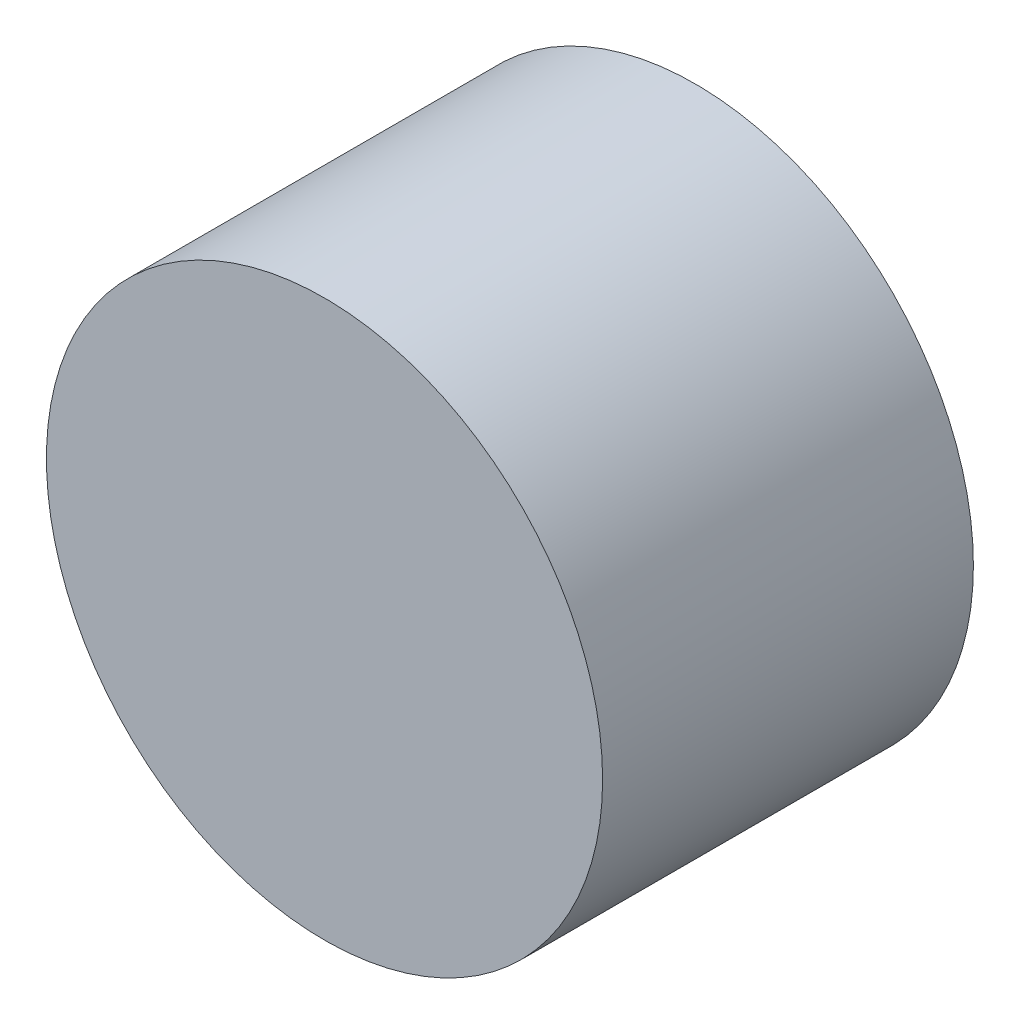
ISO-10303-21;
HEADER;
FILE_DESCRIPTION(('STEP AP214'),'2;1');
FILE_NAME('part.step','',(''),(''),'','','');
FILE_SCHEMA(('AUTOMOTIVE_DESIGN { 1 0 10303 214 1 1 1 1 }'));
ENDSEC;
DATA;
#1=APPLICATION_CONTEXT('core data for automotive mechanical design processes');
#2=APPLICATION_PROTOCOL_DEFINITION('international standard','automotive_design',2000,#1);
#3=PRODUCT_CONTEXT('',#1,'mechanical');
#4=PRODUCT('Part','Part','',(#3));
#5=PRODUCT_RELATED_PRODUCT_CATEGORY('part','',(#4));
#6=PRODUCT_DEFINITION_FORMATION('','',#4);
#7=PRODUCT_DEFINITION_CONTEXT('part definition',#1,'design');
#8=PRODUCT_DEFINITION('design','',#6,#7);
#9=PRODUCT_DEFINITION_SHAPE('','',#8);
#10=(LENGTH_UNIT() NAMED_UNIT(*) SI_UNIT(.MILLI.,.METRE.));
#11=(NAMED_UNIT(*) PLANE_ANGLE_UNIT() SI_UNIT($,.RADIAN.));
#12=(NAMED_UNIT(*) SI_UNIT($,.STERADIAN.) SOLID_ANGLE_UNIT());
#13=UNCERTAINTY_MEASURE_WITH_UNIT(LENGTH_MEASURE(1.E-05),#10,'distance_accuracy_value','');
#14=(GEOMETRIC_REPRESENTATION_CONTEXT(3) GLOBAL_UNCERTAINTY_ASSIGNED_CONTEXT((#13)) GLOBAL_UNIT_ASSIGNED_CONTEXT((#10,
#11,#12)) REPRESENTATION_CONTEXT('',''));
#15=CARTESIAN_POINT('',(0.,0.,0.));
#16=DIRECTION('',(0.,0.,1.));
#17=DIRECTION('',(1.,0.,0.));
#18=AXIS2_PLACEMENT_3D('',#15,#16,#17);
#19=CARTESIAN_POINT('',(0.,0.,2.));
#20=DIRECTION('',(0.,0.,-1.));
#21=DIRECTION('',(-1.,0.,0.));
#22=AXIS2_PLACEMENT_3D('',#19,#20,#21);
#23=CYLINDRICAL_SURFACE('',#22,1.5);
#24=CARTESIAN_POINT('',(0.,0.,2.));
#25=DIRECTION('',(0.,0.,1.));
#26=DIRECTION('',(1.,0.,0.));
#27=AXIS2_PLACEMENT_3D('',#24,#25,#26);
#28=CIRCLE('',#27,1.5);
#29=CARTESIAN_POINT('',(1.5,0.,2.));
#30=VERTEX_POINT('',#29);
#31=EDGE_CURVE('E10',#30,#30,#28,.T.);
#32=ORIENTED_EDGE('',*,*,#31,.F.);
#33=EDGE_LOOP('',(#32));
#34=FACE_BOUND('',#33,.T.);
#35=CARTESIAN_POINT('',(0.,0.,0.));
#36=DIRECTION('',(0.,0.,1.));
#37=DIRECTION('',(1.,0.,0.));
#38=AXIS2_PLACEMENT_3D('',#35,#36,#37);
#39=CIRCLE('',#38,1.5);
#40=CARTESIAN_POINT('',(1.5,0.,0.));
#41=VERTEX_POINT('',#40);
#42=EDGE_CURVE('E34',#41,#41,#39,.T.);
#43=ORIENTED_EDGE('',*,*,#42,.T.);
#44=EDGE_LOOP('',(#43));
#45=FACE_BOUND('',#44,.T.);
#46=ADVANCED_FACE('F31',(#34,#45),#23,.T.);
#47=CARTESIAN_POINT('',(0.,0.,2.));
#48=DIRECTION('',(0.,0.,1.));
#49=DIRECTION('',(1.,0.,0.));
#50=AXIS2_PLACEMENT_3D('',#47,#48,#49);
#51=PLANE('',#50);
#52=ORIENTED_EDGE('',*,*,#31,.T.);
#53=EDGE_LOOP('',(#52));
#54=FACE_BOUND('',#53,.T.);
#55=ADVANCED_FACE('F46',(#54),#51,.T.);
#56=CARTESIAN_POINT('',(0.,0.,0.));
#57=DIRECTION('',(0.,0.,1.));
#58=DIRECTION('',(1.,0.,0.));
#59=AXIS2_PLACEMENT_3D('',#56,#57,#58);
#60=PLANE('',#59);
#61=ORIENTED_EDGE('',*,*,#42,.F.);
#62=EDGE_LOOP('',(#61));
#63=FACE_BOUND('',#62,.T.);
#64=ADVANCED_FACE('F44',(#63),#60,.F.);
#65=CLOSED_SHELL('',(#46,#55,#64));
#66=MANIFOLD_SOLID_BREP('B2',#65);
#67=ADVANCED_BREP_SHAPE_REPRESENTATION('',(#18,#66),#14);
#68=SHAPE_DEFINITION_REPRESENTATION(#9,#67);
ENDSEC;
END-ISO-10303-21;
